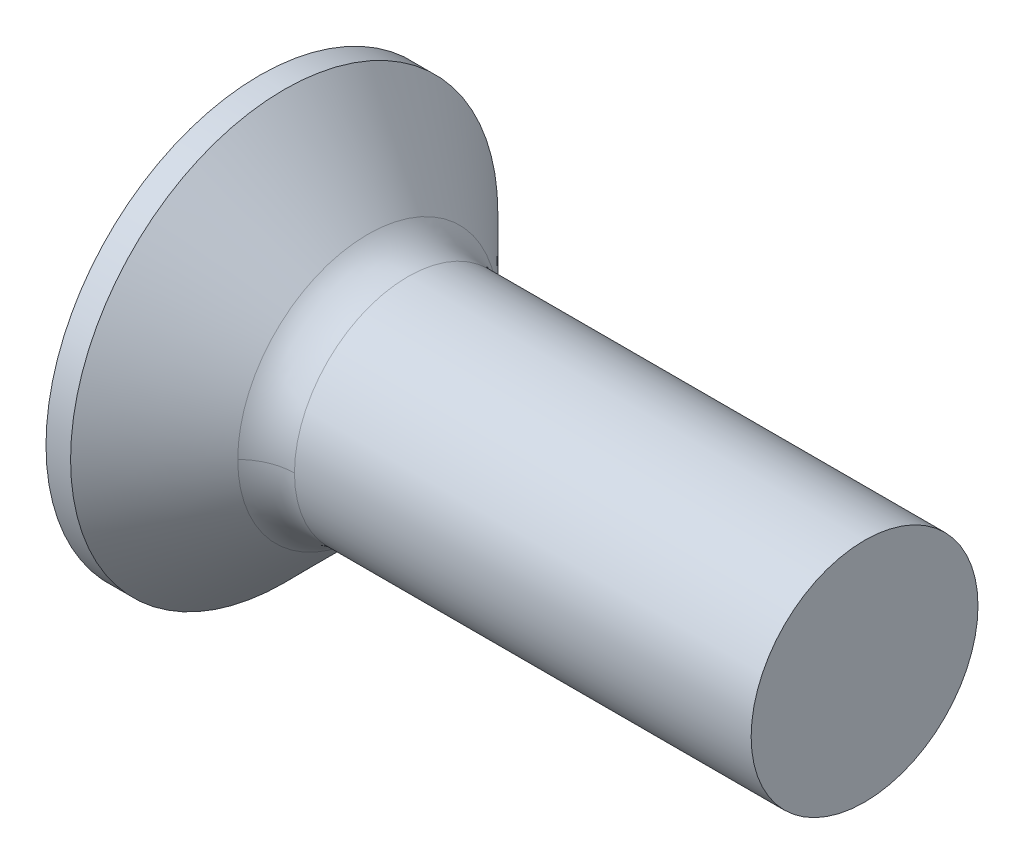
ISO-10303-21;
HEADER;
FILE_DESCRIPTION(('STEP AP214'),'2;1');
FILE_NAME('part.step','',(''),(''),'','','');
FILE_SCHEMA(('AUTOMOTIVE_DESIGN { 1 0 10303 214 1 1 1 1 }'));
ENDSEC;
DATA;
#1=APPLICATION_CONTEXT('core data for automotive mechanical design processes');
#2=APPLICATION_PROTOCOL_DEFINITION('international standard','automotive_design',2000,#1);
#3=PRODUCT_CONTEXT('',#1,'mechanical');
#4=PRODUCT('Part','Part','',(#3));
#5=PRODUCT_RELATED_PRODUCT_CATEGORY('part','',(#4));
#6=PRODUCT_DEFINITION_FORMATION('','',#4);
#7=PRODUCT_DEFINITION_CONTEXT('part definition',#1,'design');
#8=PRODUCT_DEFINITION('design','',#6,#7);
#9=PRODUCT_DEFINITION_SHAPE('','',#8);
#10=(LENGTH_UNIT() NAMED_UNIT(*) SI_UNIT(.MILLI.,.METRE.));
#11=(NAMED_UNIT(*) PLANE_ANGLE_UNIT() SI_UNIT($,.RADIAN.));
#12=(NAMED_UNIT(*) SI_UNIT($,.STERADIAN.) SOLID_ANGLE_UNIT());
#13=UNCERTAINTY_MEASURE_WITH_UNIT(LENGTH_MEASURE(1.E-05),#10,'distance_accuracy_value','');
#14=(GEOMETRIC_REPRESENTATION_CONTEXT(3) GLOBAL_UNCERTAINTY_ASSIGNED_CONTEXT((#13)) GLOBAL_UNIT_ASSIGNED_CONTEXT((#10,
#11,#12)) REPRESENTATION_CONTEXT('',''));
#15=CARTESIAN_POINT('',(0.,0.,0.));
#16=DIRECTION('',(0.,0.,1.));
#17=DIRECTION('',(1.,0.,0.));
#18=AXIS2_PLACEMENT_3D('',#15,#16,#17);
#19=CARTESIAN_POINT('',(16.,-3.036,3.036));
#20=DIRECTION('',(1.,0.,0.));
#21=DIRECTION('',(0.,0.,-1.));
#22=AXIS2_PLACEMENT_3D('',#19,#20,#21);
#23=PLANE('',#22);
#24=CARTESIAN_POINT('',(16.,0.,0.));
#25=DIRECTION('',(-1.,0.,0.));
#26=DIRECTION('',(0.,0.,1.));
#27=AXIS2_PLACEMENT_3D('',#24,#25,#26);
#28=CIRCLE('',#27,3.);
#29=CARTESIAN_POINT('',(16.,0.,3.));
#30=VERTEX_POINT('',#29);
#31=EDGE_CURVE('E20',#30,#30,#28,.F.);
#32=ORIENTED_EDGE('',*,*,#31,.T.);
#33=EDGE_LOOP('',(#32));
#34=FACE_BOUND('',#33,.T.);
#35=ADVANCED_FACE('F16',(#34),#23,.T.);
#36=CARTESIAN_POINT('',(16.,0.,0.));
#37=DIRECTION('',(-1.,0.,0.));
#38=DIRECTION('',(0.,0.,1.));
#39=AXIS2_PLACEMENT_3D('',#36,#37,#38);
#40=CYLINDRICAL_SURFACE('',#39,3.);
#41=ORIENTED_EDGE('',*,*,#31,.F.);
#42=EDGE_LOOP('',(#41));
#43=FACE_BOUND('',#42,.T.);
#44=CARTESIAN_POINT('',(3.92132034347785,0.,0.));
#45=DIRECTION('',(1.,0.,0.));
#46=DIRECTION('',(0.,0.,-1.));
#47=AXIS2_PLACEMENT_3D('',#44,#45,#46);
#48=CIRCLE('',#47,2.99999999996667);
#49=CARTESIAN_POINT('',(3.92132034360542,-3.07655142772997E-10,-2.999999999975));
#50=VERTEX_POINT('',#49);
#51=CARTESIAN_POINT('',(3.9213203434734,-1.346904426431E-10,2.999999999975));
#52=VERTEX_POINT('',#51);
#53=EDGE_CURVE('E242',#50,#52,#48,.T.);
#54=ORIENTED_EDGE('',*,*,#53,.T.);
#55=CARTESIAN_POINT('',(3.92132034347785,0.,0.));
#56=DIRECTION('',(1.,0.,0.));
#57=DIRECTION('',(0.,0.,-1.));
#58=AXIS2_PLACEMENT_3D('',#55,#56,#57);
#59=CIRCLE('',#58,2.99999999996667);
#60=EDGE_CURVE('E233',#52,#50,#59,.T.);
#61=ORIENTED_EDGE('',*,*,#60,.T.);
#62=EDGE_LOOP('',(#54,#61));
#63=FACE_BOUND('',#62,.T.);
#64=ADVANCED_FACE('F501',(#43,#63),#40,.T.);
#65=CARTESIAN_POINT('',(4.071070469,0.,3.007493752));
#66=CARTESIAN_POINT('',(4.071070469,6.014987504,3.007493752));
#67=CARTESIAN_POINT('',(4.071070469,6.014987504,-3.007493752));
#68=CARTESIAN_POINT('',(4.071070469,0.,-3.007493752));
#69=CARTESIAN_POINT('',(3.559894839,0.,2.956205113));
#70=CARTESIAN_POINT('',(3.559894839,5.912410226,2.956205113));
#71=CARTESIAN_POINT('',(3.559894839,5.912410226,-2.956205113));
#72=CARTESIAN_POINT('',(3.559894839,0.,-2.956205113));
#73=CARTESIAN_POINT('',(3.085258935,0.,3.152805742));
#74=CARTESIAN_POINT('',(3.085258935,6.305611483,3.152805742));
#75=CARTESIAN_POINT('',(3.085258935,6.305611483,-3.152805742));
#76=CARTESIAN_POINT('',(3.085258935,0.,-3.152805742));
#77=CARTESIAN_POINT('',(2.760069726,0.,3.55052804));
#78=CARTESIAN_POINT('',(2.760069726,7.10105608,3.55052804));
#79=CARTESIAN_POINT('',(2.760069726,7.10105608,-3.55052804));
#80=CARTESIAN_POINT('',(2.760069726,0.,-3.55052804));
#81=(BOUNDED_SURFACE() B_SPLINE_SURFACE(3,3,((#65,#66,#67,#68),(#69,#70,#71,#72),(#73,#74,#75,
#76),(#77,#78,#79,#80)),.UNSPECIFIED.,.F.,.F.,.F.) B_SPLINE_SURFACE_WITH_KNOTS((4,4),(4,4),(0.,
1.),(0.,1.),.UNSPECIFIED.) GEOMETRIC_REPRESENTATION_ITEM() RATIONAL_B_SPLINE_SURFACE(((1.,
0.333333333333333,0.333333333333333,1.),(0.920706259011135,0.306902086337045,0.306902086337045,
0.920706259011135),(0.920706259011135,0.306902086337045,0.306902086337045,0.920706259011135),
(1.,0.333333333333333,0.333333333333333,1.))) REPRESENTATION_ITEM('') SURFACE());
#82=CARTESIAN_POINT('',(2.86066017200004,0.,0.));
#83=DIRECTION('',(-1.,0.,0.));
#84=DIRECTION('',(0.,0.,1.));
#85=AXIS2_PLACEMENT_3D('',#82,#83,#84);
#86=CIRCLE('',#85,3.439339828);
#87=CARTESIAN_POINT('',(2.86066017203004,-1.05813058582819E-09,-3.43933982801549));
#88=VERTEX_POINT('',#87);
#89=CARTESIAN_POINT('',(2.86066017202489,-3.08830802555573E-10,3.43933982802064));
#90=VERTEX_POINT('',#89);
#91=EDGE_CURVE('E223',#88,#90,#86,.F.);
#92=CARTESIAN_POINT('',(4.071070469,0.,3.007493752));
#93=CARTESIAN_POINT('',(3.559894839,0.,2.956205113));
#94=CARTESIAN_POINT('',(3.085258935,0.,3.152805742));
#95=CARTESIAN_POINT('',(2.760069726,0.,3.55052804));
#96=(BOUNDED_CURVE() B_SPLINE_CURVE(3,(#92,#93,#94,#95),.UNSPECIFIED.,.F.,
.F.) B_SPLINE_CURVE_WITH_KNOTS((4,4),(0.,1.),
.UNSPECIFIED.) CURVE() GEOMETRIC_REPRESENTATION_ITEM() RATIONAL_B_SPLINE_CURVE((1.,
0.920706259011135,0.920706259011135,1.)) REPRESENTATION_ITEM(''));
#97=EDGE_CURVE('E234',#90,#52,#96,.F.);
#98=CARTESIAN_POINT('',(4.071070469,0.,-3.007493752));
#99=CARTESIAN_POINT('',(3.559894839,0.,-2.956205113));
#100=CARTESIAN_POINT('',(3.085258935,0.,-3.152805742));
#101=CARTESIAN_POINT('',(2.760069726,0.,-3.55052804));
#102=(BOUNDED_CURVE() B_SPLINE_CURVE(3,(#98,#99,#100,#101),.UNSPECIFIED.,.F.,
.F.) B_SPLINE_CURVE_WITH_KNOTS((4,4),(0.,1.),
.UNSPECIFIED.) CURVE() GEOMETRIC_REPRESENTATION_ITEM() RATIONAL_B_SPLINE_CURVE((1.,
0.920706259011135,0.920706259011135,1.)) REPRESENTATION_ITEM(''));
#103=EDGE_CURVE('E226',#50,#88,#102,.T.);
#104=ORIENTED_EDGE('',*,*,#91,.T.);
#105=ORIENTED_EDGE('',*,*,#97,.T.);
#106=ORIENTED_EDGE('',*,*,#53,.F.);
#107=ORIENTED_EDGE('',*,*,#103,.T.);
#108=EDGE_LOOP('',(#104,#105,#106,#107));
#109=FACE_BOUND('',#108,.T.);
#110=ADVANCED_FACE('F485',(#109),#81,.F.);
#111=CARTESIAN_POINT('',(4.071070469,0.,-3.007493752));
#112=CARTESIAN_POINT('',(4.071070469,-6.014987504,-3.007493752));
#113=CARTESIAN_POINT('',(4.071070469,-6.014987504,3.007493752));
#114=CARTESIAN_POINT('',(4.071070469,0.,3.007493752));
#115=CARTESIAN_POINT('',(3.559894839,0.,-2.956205113));
#116=CARTESIAN_POINT('',(3.559894839,-5.912410226,-2.956205113));
#117=CARTESIAN_POINT('',(3.559894839,-5.912410226,2.956205113));
#118=CARTESIAN_POINT('',(3.559894839,0.,2.956205113));
#119=CARTESIAN_POINT('',(3.085258935,0.,-3.152805742));
#120=CARTESIAN_POINT('',(3.085258935,-6.305611483,-3.152805742));
#121=CARTESIAN_POINT('',(3.085258935,-6.305611483,3.152805742));
#122=CARTESIAN_POINT('',(3.085258935,0.,3.152805742));
#123=CARTESIAN_POINT('',(2.760069726,0.,-3.55052804));
#124=CARTESIAN_POINT('',(2.760069726,-7.10105608,-3.55052804));
#125=CARTESIAN_POINT('',(2.760069726,-7.10105608,3.55052804));
#126=CARTESIAN_POINT('',(2.760069726,0.,3.55052804));
#127=(BOUNDED_SURFACE() B_SPLINE_SURFACE(3,3,((#111,#112,#113,#114),(#115,#116,#117,#118),(#119,
#120,#121,#122),(#123,#124,#125,#126)),.UNSPECIFIED.,.F.,.F.,
.F.) B_SPLINE_SURFACE_WITH_KNOTS((4,4),(4,4),(0.,1.),(0.,1.),
.UNSPECIFIED.) GEOMETRIC_REPRESENTATION_ITEM() RATIONAL_B_SPLINE_SURFACE(((1.,0.333333333333333,
0.333333333333333,1.),(0.920706259011135,0.306902086337045,0.306902086337045,0.920706259011135),
(0.920706259011135,0.306902086337045,0.306902086337045,0.920706259011135),(1.,0.333333333333333,
0.333333333333333,1.))) REPRESENTATION_ITEM('') SURFACE());
#128=CARTESIAN_POINT('',(2.86066017200004,0.,0.));
#129=DIRECTION('',(-1.,0.,0.));
#130=DIRECTION('',(0.,0.,1.));
#131=AXIS2_PLACEMENT_3D('',#128,#129,#130);
#132=CIRCLE('',#131,3.439339828);
#133=EDGE_CURVE('E219',#90,#88,#132,.F.);
#134=ORIENTED_EDGE('',*,*,#103,.F.);
#135=ORIENTED_EDGE('',*,*,#60,.F.);
#136=ORIENTED_EDGE('',*,*,#97,.F.);
#137=ORIENTED_EDGE('',*,*,#133,.T.);
#138=EDGE_LOOP('',(#134,#135,#136,#137));
#139=FACE_BOUND('',#138,.T.);
#140=ADVANCED_FACE('F477',(#139),#127,.F.);
#141=CARTESIAN_POINT('',(2.860660172,0.,0.));
#142=DIRECTION('',(-1.,0.,0.));
#143=DIRECTION('',(0.,-1.,0.));
#144=AXIS2_PLACEMENT_3D('',#141,#142,#143);
#145=CONICAL_SURFACE('',#144,3.439339828,0.785398163397448);
#146=ORIENTED_EDGE('',*,*,#133,.F.);
#147=ORIENTED_EDGE('',*,*,#91,.F.);
#148=EDGE_LOOP('',(#146,#147));
#149=FACE_BOUND('',#148,.T.);
#150=CARTESIAN_POINT('',(0.65,0.,0.));
#151=DIRECTION('',(-1.,0.,0.));
#152=DIRECTION('',(0.,0.,1.));
#153=AXIS2_PLACEMENT_3D('',#150,#151,#152);
#154=CIRCLE('',#153,5.65);
#155=CARTESIAN_POINT('',(0.65,0.,5.65));
#156=VERTEX_POINT('',#155);
#157=EDGE_CURVE('E205',#156,#156,#154,.F.);
#158=ORIENTED_EDGE('',*,*,#157,.T.);
#159=EDGE_LOOP('',(#158));
#160=FACE_BOUND('',#159,.T.);
#161=ADVANCED_FACE('F475',(#149,#160),#145,.T.);
#162=CARTESIAN_POINT('',(3.45,-1.579893512,-0.71));
#163=DIRECTION('',(-0.446197800689229,0.894934367794698,0.));
#164=DIRECTION('',(-0.894934367794698,-0.446197800689229,0.));
#165=AXIS2_PLACEMENT_3D('',#162,#163,#164);
#166=PLANE('',#165);
#167=DIRECTION('',(-0.894934367740282,-0.44619780079837,0.));
#168=VECTOR('',#167,1.);
#169=CARTESIAN_POINT('',(3.45,-1.57989351138299,0.71));
#170=LINE('',#169,#168);
#171=CARTESIAN_POINT('',(3.45,-1.5798935116915,0.71));
#172=VERTEX_POINT('',#171);
#173=CARTESIAN_POINT('',(-9.15153369751565E-12,-3.29999999998164,0.710000002242601));
#174=VERTEX_POINT('',#173);
#175=EDGE_CURVE('E202',#172,#174,#170,.T.);
#176=ORIENTED_EDGE('',*,*,#175,.F.);
#177=DIRECTION('',(0.,0.,-1.));
#178=VECTOR('',#177,1.);
#179=CARTESIAN_POINT('',(3.45,-1.579893512,0.));
#180=LINE('',#179,#178);
#181=CARTESIAN_POINT('',(3.45,-1.5798935116915,-0.71));
#182=VERTEX_POINT('',#181);
#183=EDGE_CURVE('E217',#172,#182,#180,.T.);
#184=ORIENTED_EDGE('',*,*,#183,.T.);
#185=DIRECTION('',(0.894934367740282,0.44619780079837,0.));
#186=VECTOR('',#185,1.);
#187=CARTESIAN_POINT('',(0.,-3.29999999990833,-0.71));
#188=LINE('',#187,#186);
#189=CARTESIAN_POINT('',(-9.15155371455694E-12,-3.29999999998164,-0.7100000022426));
#190=VERTEX_POINT('',#189);
#191=EDGE_CURVE('E158',#190,#182,#188,.T.);
#192=ORIENTED_EDGE('',*,*,#191,.F.);
#193=DIRECTION('',(0.,0.,1.));
#194=VECTOR('',#193,1.);
#195=CARTESIAN_POINT('',(0.,-3.3,0.));
#196=LINE('',#195,#194);
#197=EDGE_CURVE('E164',#190,#174,#196,.T.);
#198=ORIENTED_EDGE('',*,*,#197,.T.);
#199=EDGE_LOOP('',(#176,#184,#192,#198));
#200=FACE_BOUND('',#199,.T.);
#201=ADVANCED_FACE('F462',(#200),#166,.T.);
#202=CARTESIAN_POINT('',(3.45,0.,0.));
#203=DIRECTION('',(-1.,0.,0.));
#204=DIRECTION('',(0.,0.,1.));
#205=AXIS2_PLACEMENT_3D('',#202,#203,#204);
#206=CONICAL_SURFACE('',#205,1.2805,0.0698131700206101);
#207=CARTESIAN_POINT('',(0.,0.,0.));
#208=DIRECTION('',(-1.,0.,0.));
#209=DIRECTION('',(0.,0.,1.));
#210=AXIS2_PLACEMENT_3D('',#207,#208,#209);
#211=CIRCLE('',#210,1.521747501);
#212=CARTESIAN_POINT('',(-1.98757490879553E-11,-0.7100000022426,-1.34596264941472));
#213=VERTEX_POINT('',#212);
#214=CARTESIAN_POINT('',(-2.0018081073557E-11,-1.34596264941473,-0.7100000022426));
#215=VERTEX_POINT('',#214);
#216=EDGE_CURVE('E138',#213,#215,#211,.T.);
#217=ORIENTED_EDGE('',*,*,#216,.T.);
#218=CARTESIAN_POINT('',(3.44999999996933,-1.06563607763892,-0.709999999965281));
#219=CARTESIAN_POINT('',(3.05239804319664,-1.09903290978623,-0.709999999987832));
#220=CARTESIAN_POINT('',(2.65475821752246,-1.13197492179622,-0.709999999996809));
#221=CARTESIAN_POINT('',(1.859418568149,-1.19711780637158,-0.710000000003191));
#222=CARTESIAN_POINT('',(1.46171874456479,-1.22931868034064,-0.710000000000595));
#223=CARTESIAN_POINT('',(0.886672014067367,-1.2754623780766,-0.709999999999735));
#224=CARTESIAN_POINT('',(0.70934344088065,-1.2896345562043,-0.709999999999868));
#225=CARTESIAN_POINT('',(0.354677833209052,-1.31787453536712,-0.710000000000133));
#226=CARTESIAN_POINT('',(0.177340798717209,-1.33194233631483,-0.710000000000265));
#227=CARTESIAN_POINT('',(-4.00360912278943E-11,-1.34596265059929,-0.71));
#228=B_SPLINE_CURVE_WITH_KNOTS('',3,(#218,#219,#220,#221,#222,#223,#224,#225,#226,#227),
.UNSPECIFIED.,.F.,.F.,(4,2,2,2,4),(0.,1.19700553542681,2.39400880358524,2.92769077313542,
3.46137318953635),.UNSPECIFIED.);
#229=CARTESIAN_POINT('',(3.44999999999998,-1.06563607782568,-0.709999999743873));
#230=VERTEX_POINT('',#229);
#231=EDGE_CURVE('E144',#230,#215,#228,.T.);
#232=ORIENTED_EDGE('',*,*,#231,.F.);
#233=CARTESIAN_POINT('',(3.44999999999995,0.,0.));
#234=DIRECTION('',(-1.,0.,0.));
#235=DIRECTION('',(0.,0.,1.));
#236=AXIS2_PLACEMENT_3D('',#233,#234,#235);
#237=CIRCLE('',#236,1.2805);
#238=CARTESIAN_POINT('',(3.44999999999995,-0.709999999757469,-1.06563607781662));
#239=VERTEX_POINT('',#238);
#240=EDGE_CURVE('E149',#230,#239,#237,.F.);
#241=ORIENTED_EDGE('',*,*,#240,.T.);
#242=CARTESIAN_POINT('',(-3.97514937370692E-11,-0.71,-1.34596265059927));
#243=CARTESIAN_POINT('',(0.472697147041394,-0.71,-1.30857045299318));
#244=CARTESIAN_POINT('',(0.945371396486863,-0.71,-1.2708795223401));
#245=CARTESIAN_POINT('',(1.89064711681851,-0.71,-1.19461362364889));
#246=CARTESIAN_POINT('',(2.36324858790939,-0.71,-1.15603865814475));
#247=CARTESIAN_POINT('',(3.04054381210254,-0.71,-1.09991132788619));
#248=CARTESIAN_POINT('',(3.24527698184166,-0.71,-1.08283447895016));
#249=CARTESIAN_POINT('',(3.44999999997136,-0.71,-1.06563607765744));
#250=B_SPLINE_CURVE_WITH_KNOTS('',3,(#242,#243,#244,#245,#246,#247,#248,#249),.UNSPECIFIED.,.F.,
.F.,(4,2,2,4),(0.,1.42252243057653,2.84504078416987,3.4613730974833),.UNSPECIFIED.);
#251=EDGE_CURVE('E146',#213,#239,#250,.T.);
#252=ORIENTED_EDGE('',*,*,#251,.F.);
#253=EDGE_LOOP('',(#217,#232,#241,#252));
#254=FACE_BOUND('',#253,.T.);
#255=ADVANCED_FACE('F143',(#254),#206,.F.);
#256=CARTESIAN_POINT('',(3.45,0.71,-1.579893512));
#257=DIRECTION('',(-0.446197800689229,0.,0.894934367794698));
#258=DIRECTION('',(-0.894934367794698,0.,-0.446197800689229));
#259=AXIS2_PLACEMENT_3D('',#256,#257,#258);
#260=PLANE('',#259);
#261=DIRECTION('',(-0.894934367740282,0.,-0.44619780079837));
#262=VECTOR('',#261,1.);
#263=CARTESIAN_POINT('',(3.45,-0.71,-1.57989351138299));
#264=LINE('',#263,#262);
#265=CARTESIAN_POINT('',(3.45,-0.71,-1.5798935116915));
#266=VERTEX_POINT('',#265);
#267=CARTESIAN_POINT('',(-9.15153369751565E-12,-0.7100000022426,-3.29999999998164));
#268=VERTEX_POINT('',#267);
#269=EDGE_CURVE('E198',#266,#268,#264,.T.);
#270=ORIENTED_EDGE('',*,*,#269,.F.);
#271=DIRECTION('',(0.,1.,0.));
#272=VECTOR('',#271,1.);
#273=CARTESIAN_POINT('',(3.45,0.,-1.579893512));
#274=LINE('',#273,#272);
#275=CARTESIAN_POINT('',(3.45,0.71,-1.5798935116915));
#276=VERTEX_POINT('',#275);
#277=EDGE_CURVE('E214',#266,#276,#274,.T.);
#278=ORIENTED_EDGE('',*,*,#277,.T.);
#279=DIRECTION('',(0.894934367740282,0.,0.44619780079837));
#280=VECTOR('',#279,1.);
#281=CARTESIAN_POINT('',(0.,0.71,-3.29999999990833));
#282=LINE('',#281,#280);
#283=CARTESIAN_POINT('',(-9.15155371455694E-12,0.710000002242601,-3.29999999998164));
#284=VERTEX_POINT('',#283);
#285=EDGE_CURVE('E360',#284,#276,#282,.T.);
#286=ORIENTED_EDGE('',*,*,#285,.F.);
#287=DIRECTION('',(0.,-1.,0.));
#288=VECTOR('',#287,1.);
#289=CARTESIAN_POINT('',(0.,0.,-3.3));
#290=LINE('',#289,#288);
#291=EDGE_CURVE('E148',#284,#268,#290,.T.);
#292=ORIENTED_EDGE('',*,*,#291,.T.);
#293=EDGE_LOOP('',(#270,#278,#286,#292));
#294=FACE_BOUND('',#293,.T.);
#295=ADVANCED_FACE('F381',(#294),#260,.T.);
#296=CARTESIAN_POINT('',(3.45,0.,0.));
#297=DIRECTION('',(-1.,0.,0.));
#298=DIRECTION('',(0.,0.,1.));
#299=AXIS2_PLACEMENT_3D('',#296,#297,#298);
#300=CONICAL_SURFACE('',#299,1.2805,0.0698131700206101);
#301=CARTESIAN_POINT('',(3.44999999999995,0.,0.));
#302=DIRECTION('',(-1.,0.,0.));
#303=DIRECTION('',(0.,0.,1.));
#304=AXIS2_PLACEMENT_3D('',#301,#302,#303);
#305=CIRCLE('',#304,1.2805);
#306=CARTESIAN_POINT('',(3.44999999999998,0.709999999853156,-1.06563607775287));
#307=VERTEX_POINT('',#306);
#308=CARTESIAN_POINT('',(3.44999999999352,1.06563607753498,-0.710000000181004));
#309=VERTEX_POINT('',#308);
#310=EDGE_CURVE('E209',#307,#309,#305,.F.);
#311=ORIENTED_EDGE('',*,*,#310,.T.);
#312=CARTESIAN_POINT('',(-4.20398786480878E-11,1.34596265059945,-0.71));
#313=CARTESIAN_POINT('',(0.472697147039157,1.30857045299336,-0.71));
#314=CARTESIAN_POINT('',(0.945371396484674,1.27087952234027,-0.71));
#315=CARTESIAN_POINT('',(1.89064711681642,1.19461362364906,-0.71));
#316=CARTESIAN_POINT('',(2.36324858790735,1.15603865814491,-0.71));
#317=CARTESIAN_POINT('',(3.04054381210645,1.09991132788587,-0.71));
#318=CARTESIAN_POINT('',(3.24527698185149,1.08283447894934,-0.71));
#319=CARTESIAN_POINT('',(3.44999999998709,1.06563607765612,-0.71));
#320=B_SPLINE_CURVE_WITH_KNOTS('',3,(#312,#313,#314,#315,#316,#317,#318,#319),.UNSPECIFIED.,.F.,
.F.,(4,2,2,4),(0.,1.42252243057668,2.84504078417017,3.46137309750138),.UNSPECIFIED.);
#321=CARTESIAN_POINT('',(-2.10199421441777E-11,1.34596264941481,-0.7100000022426));
#322=VERTEX_POINT('',#321);
#323=EDGE_CURVE('E193',#322,#309,#320,.T.);
#324=ORIENTED_EDGE('',*,*,#323,.F.);
#325=CARTESIAN_POINT('',(0.,0.,0.));
#326=DIRECTION('',(-1.,0.,0.));
#327=DIRECTION('',(0.,0.,1.));
#328=AXIS2_PLACEMENT_3D('',#325,#326,#327);
#329=CIRCLE('',#328,1.521747501);
#330=CARTESIAN_POINT('',(-2.44523019773076E-11,0.710000002242601,-1.34596264941508));
#331=VERTEX_POINT('',#330);
#332=EDGE_CURVE('E212',#322,#331,#329,.T.);
#333=ORIENTED_EDGE('',*,*,#332,.T.);
#334=CARTESIAN_POINT('',(3.44999999997501,0.710000000001709,-1.06563607765805));
#335=CARTESIAN_POINT('',(3.0523980432014,0.710000000000599,-1.09903290979271));
#336=CARTESIAN_POINT('',(2.65475821752692,0.710000000000157,-1.13197492179766));
#337=CARTESIAN_POINT('',(1.8594185681534,0.709999999999843,-1.19711780636942));
#338=CARTESIAN_POINT('',(1.46171874456944,0.709999999999971,-1.22931868033993));
#339=CARTESIAN_POINT('',(0.88667201406989,0.710000000000013,-1.27546237807654));
#340=CARTESIAN_POINT('',(0.709343440880891,0.710000000000007,-1.28963455620435));
#341=CARTESIAN_POINT('',(0.354677833204729,0.709999999999994,-1.31787453536739));
#342=CARTESIAN_POINT('',(0.177340798710604,0.709999999999987,-1.3319423363152));
#343=CARTESIAN_POINT('',(-4.89046651199288E-11,0.71,-1.34596265059999));
#344=B_SPLINE_CURVE_WITH_KNOTS('',3,(#334,#335,#336,#337,#338,#339,#340,#341,#342,#343),
.UNSPECIFIED.,.F.,.F.,(4,2,2,2,4),(0.,1.19700553542644,2.39400880358452,2.92769077314155,
3.46137318954933),.UNSPECIFIED.);
#345=EDGE_CURVE('E197',#307,#331,#344,.T.);
#346=ORIENTED_EDGE('',*,*,#345,.F.);
#347=EDGE_LOOP('',(#311,#324,#333,#346));
#348=FACE_BOUND('',#347,.T.);
#349=ADVANCED_FACE('F376',(#348),#300,.F.);
#350=CARTESIAN_POINT('',(0.,3.3,-0.71));
#351=DIRECTION('',(-0.446197800689229,-0.894934367794698,0.));
#352=DIRECTION('',(0.894934367794698,-0.446197800689229,0.));
#353=AXIS2_PLACEMENT_3D('',#350,#351,#352);
#354=PLANE('',#353);
#355=DIRECTION('',(-0.894934367740282,0.44619780079837,0.));
#356=VECTOR('',#355,1.);
#357=CARTESIAN_POINT('',(3.45,1.57989351138299,-0.71));
#358=LINE('',#357,#356);
#359=CARTESIAN_POINT('',(3.45,1.5798935116915,-0.71));
#360=VERTEX_POINT('',#359);
#361=CARTESIAN_POINT('',(-9.15153369751565E-12,3.29999999998164,-0.7100000022426));
#362=VERTEX_POINT('',#361);
#363=EDGE_CURVE('E190',#360,#362,#358,.T.);
#364=ORIENTED_EDGE('',*,*,#363,.F.);
#365=DIRECTION('',(0.,0.,1.));
#366=VECTOR('',#365,1.);
#367=CARTESIAN_POINT('',(3.45,1.579893512,0.));
#368=LINE('',#367,#366);
#369=CARTESIAN_POINT('',(3.45,1.5798935116915,0.71));
#370=VERTEX_POINT('',#369);
#371=EDGE_CURVE('E208',#360,#370,#368,.T.);
#372=ORIENTED_EDGE('',*,*,#371,.T.);
#373=DIRECTION('',(0.894934367740282,-0.44619780079837,0.));
#374=VECTOR('',#373,1.);
#375=CARTESIAN_POINT('',(0.,3.29999999990833,0.71));
#376=LINE('',#375,#374);
#377=CARTESIAN_POINT('',(-9.15155371455694E-12,3.29999999998164,0.710000002242601));
#378=VERTEX_POINT('',#377);
#379=EDGE_CURVE('E187',#378,#370,#376,.T.);
#380=ORIENTED_EDGE('',*,*,#379,.F.);
#381=DIRECTION('',(0.,0.,-1.));
#382=VECTOR('',#381,1.);
#383=CARTESIAN_POINT('',(0.,3.3,0.));
#384=LINE('',#383,#382);
#385=EDGE_CURVE('E206',#378,#362,#384,.T.);
#386=ORIENTED_EDGE('',*,*,#385,.T.);
#387=EDGE_LOOP('',(#364,#372,#380,#386));
#388=FACE_BOUND('',#387,.T.);
#389=ADVANCED_FACE('F380',(#388),#354,.T.);
#390=CARTESIAN_POINT('',(0.65,0.,0.));
#391=DIRECTION('',(-1.,0.,0.));
#392=DIRECTION('',(0.,0.,1.));
#393=AXIS2_PLACEMENT_3D('',#390,#391,#392);
#394=CYLINDRICAL_SURFACE('',#393,5.65);
#395=ORIENTED_EDGE('',*,*,#157,.F.);
#396=EDGE_LOOP('',(#395));
#397=FACE_BOUND('',#396,.T.);
#398=CARTESIAN_POINT('',(0.,0.,0.));
#399=DIRECTION('',(-1.,0.,0.));
#400=DIRECTION('',(0.,0.,1.));
#401=AXIS2_PLACEMENT_3D('',#398,#399,#400);
#402=CIRCLE('',#401,5.65);
#403=CARTESIAN_POINT('',(0.,0.,5.65));
#404=VERTEX_POINT('',#403);
#405=EDGE_CURVE('E400',#404,#404,#402,.T.);
#406=ORIENTED_EDGE('',*,*,#405,.F.);
#407=EDGE_LOOP('',(#406));
#408=FACE_BOUND('',#407,.T.);
#409=ADVANCED_FACE('F382',(#397,#408),#394,.T.);
#410=CARTESIAN_POINT('',(0.,-3.313406184,0.71));
#411=DIRECTION('',(0.,0.,-1.));
#412=DIRECTION('',(0.,1.,0.));
#413=AXIS2_PLACEMENT_3D('',#410,#411,#412);
#414=PLANE('',#413);
#415=DIRECTION('',(0.,-1.,0.));
#416=VECTOR('',#415,1.);
#417=CARTESIAN_POINT('',(3.45,-2.182818039,0.71));
#418=LINE('',#417,#416);
#419=CARTESIAN_POINT('',(3.44999999999998,-1.06563607774381,0.709999999866751));
#420=VERTEX_POINT('',#419);
#421=EDGE_CURVE('E203',#420,#172,#418,.T.);
#422=ORIENTED_EDGE('',*,*,#421,.T.);
#423=ORIENTED_EDGE('',*,*,#175,.T.);
#424=DIRECTION('',(0.,-1.,0.));
#425=VECTOR('',#424,1.);
#426=CARTESIAN_POINT('',(0.,0.,0.710000004485201));
#427=LINE('',#426,#425);
#428=CARTESIAN_POINT('',(-3.16977542704161E-11,-1.34596264941565,0.710000002242601));
#429=VERTEX_POINT('',#428);
#430=EDGE_CURVE('E167',#429,#174,#427,.T.);
#431=ORIENTED_EDGE('',*,*,#430,.F.);
#432=CARTESIAN_POINT('',(3.44999999997908,-1.06563607765719,0.71000000000074));
#433=CARTESIAN_POINT('',(3.05239804320558,-1.09903290979218,0.71000000000026));
#434=CARTESIAN_POINT('',(2.6547582175312,-1.13197492179726,0.710000000000068));
#435=CARTESIAN_POINT('',(1.85941856815787,-1.19711780636911,0.709999999999932));
#436=CARTESIAN_POINT('',(1.46171874457399,-1.22931868033957,0.709999999999987));
#437=CARTESIAN_POINT('',(0.88667201407134,-1.27546237807643,0.710000000000006));
#438=CARTESIAN_POINT('',(0.709343440879154,-1.28963455620449,0.710000000000003));
#439=CARTESIAN_POINT('',(0.354677833196615,-1.31787453536803,0.709999999999997));
#440=CARTESIAN_POINT('',(0.177340798699302,-1.3319423363161,0.709999999999995));
#441=CARTESIAN_POINT('',(-6.33953695709904E-11,-1.34596265060114,0.71));
#442=B_SPLINE_CURVE_WITH_KNOTS('',3,(#432,#433,#434,#435,#436,#437,#438,#439,#440,#441),
.UNSPECIFIED.,.F.,.F.,(4,2,2,2,4),(0.,1.19700553542617,2.39400880358399,2.92769077315061,
3.46137318956799),.UNSPECIFIED.);
#443=EDGE_CURVE('E186',#420,#429,#442,.T.);
#444=ORIENTED_EDGE('',*,*,#443,.F.);
#445=EDGE_LOOP('',(#422,#423,#431,#444));
#446=FACE_BOUND('',#445,.T.);
#447=ADVANCED_FACE('F401',(#446),#414,.T.);
#448=CARTESIAN_POINT('',(0.,-3.313406184,-0.71));
#449=DIRECTION('',(0.,0.,1.));
#450=DIRECTION('',(1.,0.,0.));
#451=AXIS2_PLACEMENT_3D('',#448,#449,#450);
#452=PLANE('',#451);
#453=DIRECTION('',(0.,1.,0.));
#454=VECTOR('',#453,1.);
#455=CARTESIAN_POINT('',(0.,0.,-0.710000004485199));
#456=LINE('',#455,#454);
#457=EDGE_CURVE('E154',#190,#215,#456,.T.);
#458=ORIENTED_EDGE('',*,*,#457,.F.);
#459=ORIENTED_EDGE('',*,*,#191,.T.);
#460=DIRECTION('',(0.,1.,0.));
#461=VECTOR('',#460,1.);
#462=CARTESIAN_POINT('',(3.45,-2.182818039,-0.71));
#463=LINE('',#462,#461);
#464=EDGE_CURVE('E156',#182,#230,#463,.T.);
#465=ORIENTED_EDGE('',*,*,#464,.T.);
#466=ORIENTED_EDGE('',*,*,#231,.T.);
#467=EDGE_LOOP('',(#458,#459,#465,#466));
#468=FACE_BOUND('',#467,.T.);
#469=ADVANCED_FACE('F152',(#468),#452,.T.);
#470=CARTESIAN_POINT('',(0.,-0.71,-3.313406184));
#471=DIRECTION('',(0.,1.,0.));
#472=DIRECTION('',(0.,0.,1.));
#473=AXIS2_PLACEMENT_3D('',#470,#471,#472);
#474=PLANE('',#473);
#475=DIRECTION('',(0.,0.,-1.));
#476=VECTOR('',#475,1.);
#477=CARTESIAN_POINT('',(3.45,-0.71,-2.182818039));
#478=LINE('',#477,#476);
#479=EDGE_CURVE('E199',#239,#266,#478,.T.);
#480=ORIENTED_EDGE('',*,*,#479,.T.);
#481=ORIENTED_EDGE('',*,*,#269,.T.);
#482=DIRECTION('',(0.,0.,-1.));
#483=VECTOR('',#482,1.);
#484=CARTESIAN_POINT('',(0.,-0.710000004485199,0.));
#485=LINE('',#484,#483);
#486=EDGE_CURVE('E166',#213,#268,#485,.T.);
#487=ORIENTED_EDGE('',*,*,#486,.F.);
#488=ORIENTED_EDGE('',*,*,#251,.T.);
#489=EDGE_LOOP('',(#480,#481,#487,#488));
#490=FACE_BOUND('',#489,.T.);
#491=ADVANCED_FACE('F410',(#490),#474,.T.);
#492=CARTESIAN_POINT('',(0.,0.71,-3.313406184));
#493=DIRECTION('',(0.,-1.,0.));
#494=DIRECTION('',(1.,0.,0.));
#495=AXIS2_PLACEMENT_3D('',#492,#493,#494);
#496=PLANE('',#495);
#497=DIRECTION('',(0.,0.,1.));
#498=VECTOR('',#497,1.);
#499=CARTESIAN_POINT('',(0.,0.710000004485201,0.));
#500=LINE('',#499,#498);
#501=EDGE_CURVE('E169',#284,#331,#500,.T.);
#502=ORIENTED_EDGE('',*,*,#501,.F.);
#503=ORIENTED_EDGE('',*,*,#285,.T.);
#504=DIRECTION('',(0.,0.,1.));
#505=VECTOR('',#504,1.);
#506=CARTESIAN_POINT('',(3.45,0.71,-2.182818039));
#507=LINE('',#506,#505);
#508=EDGE_CURVE('E194',#276,#307,#507,.T.);
#509=ORIENTED_EDGE('',*,*,#508,.T.);
#510=ORIENTED_EDGE('',*,*,#345,.T.);
#511=EDGE_LOOP('',(#502,#503,#509,#510));
#512=FACE_BOUND('',#511,.T.);
#513=ADVANCED_FACE('F359',(#512),#496,.T.);
#514=CARTESIAN_POINT('',(0.,1.052229894,-0.71));
#515=DIRECTION('',(0.,0.,1.));
#516=DIRECTION('',(1.,0.,0.));
#517=AXIS2_PLACEMENT_3D('',#514,#515,#516);
#518=PLANE('',#517);
#519=DIRECTION('',(0.,1.,0.));
#520=VECTOR('',#519,1.);
#521=CARTESIAN_POINT('',(3.45,2.182818039,-0.71));
#522=LINE('',#521,#520);
#523=EDGE_CURVE('E191',#309,#360,#522,.T.);
#524=ORIENTED_EDGE('',*,*,#523,.T.);
#525=ORIENTED_EDGE('',*,*,#363,.T.);
#526=DIRECTION('',(0.,1.,0.));
#527=VECTOR('',#526,1.);
#528=CARTESIAN_POINT('',(0.,0.,-0.710000004485199));
#529=LINE('',#528,#527);
#530=EDGE_CURVE('E350',#322,#362,#529,.T.);
#531=ORIENTED_EDGE('',*,*,#530,.F.);
#532=ORIENTED_EDGE('',*,*,#323,.T.);
#533=EDGE_LOOP('',(#524,#525,#531,#532));
#534=FACE_BOUND('',#533,.T.);
#535=ADVANCED_FACE('F303',(#534),#518,.T.);
#536=CARTESIAN_POINT('',(0.,1.052229894,0.71));
#537=DIRECTION('',(0.,0.,-1.));
#538=DIRECTION('',(0.,1.,0.));
#539=AXIS2_PLACEMENT_3D('',#536,#537,#538);
#540=PLANE('',#539);
#541=DIRECTION('',(0.,-1.,0.));
#542=VECTOR('',#541,1.);
#543=CARTESIAN_POINT('',(0.,0.,0.710000004485201));
#544=LINE('',#543,#542);
#545=CARTESIAN_POINT('',(0.,1.34596264941314,0.710000002242601));
#546=VERTEX_POINT('',#545);
#547=EDGE_CURVE('E178',#378,#546,#544,.T.);
#548=ORIENTED_EDGE('',*,*,#547,.F.);
#549=ORIENTED_EDGE('',*,*,#379,.T.);
#550=DIRECTION('',(0.,-1.,0.));
#551=VECTOR('',#550,1.);
#552=CARTESIAN_POINT('',(3.45,2.182818039,0.71));
#553=LINE('',#552,#551);
#554=CARTESIAN_POINT('',(3.44999999999218,1.06563607768071,0.709999999962439));
#555=VERTEX_POINT('',#554);
#556=EDGE_CURVE('E188',#370,#555,#553,.T.);
#557=ORIENTED_EDGE('',*,*,#556,.T.);
#558=CARTESIAN_POINT('',(-5.93884078238237E-11,1.34596265060082,0.71));
#559=CARTESIAN_POINT('',(0.472697147022186,1.30857045299471,0.71));
#560=CARTESIAN_POINT('',(0.94537139646808,1.2708795223416,0.71));
#561=CARTESIAN_POINT('',(1.89064711680058,1.19461362365035,0.71));
#562=CARTESIAN_POINT('',(2.36324858789189,1.15603865814618,0.71));
#563=CARTESIAN_POINT('',(3.0405438120955,1.09991132788678,0.71));
#564=CARTESIAN_POINT('',(3.24527698184466,1.08283447894991,0.71));
#565=CARTESIAN_POINT('',(3.44999999998439,1.06563607765634,0.71));
#566=B_SPLINE_CURVE_WITH_KNOTS('',3,(#558,#559,#560,#561,#562,#563,#564,#565),.UNSPECIFIED.,.F.,
.F.,(4,2,2,4),(0.,1.42252243057782,2.84504078417244,3.46137309751608),.UNSPECIFIED.);
#567=EDGE_CURVE('E288',#546,#555,#566,.T.);
#568=ORIENTED_EDGE('',*,*,#567,.F.);
#569=EDGE_LOOP('',(#548,#549,#557,#568));
#570=FACE_BOUND('',#569,.T.);
#571=ADVANCED_FACE('F298',(#570),#540,.T.);
#572=CARTESIAN_POINT('',(3.45,0.,0.));
#573=DIRECTION('',(-1.,0.,0.));
#574=DIRECTION('',(0.,0.,1.));
#575=AXIS2_PLACEMENT_3D('',#572,#573,#574);
#576=CONICAL_SURFACE('',#575,1.2805,0.0698131700206101);
#577=CARTESIAN_POINT('',(3.44999999999995,0.,0.));
#578=DIRECTION('',(-1.,0.,0.));
#579=DIRECTION('',(0.,0.,1.));
#580=AXIS2_PLACEMENT_3D('',#577,#578,#579);
#581=CIRCLE('',#580,1.2805);
#582=CARTESIAN_POINT('',(3.44999999999998,-0.710000000167409,1.06563607754349));
#583=VERTEX_POINT('',#582);
#584=EDGE_CURVE('E184',#583,#420,#581,.F.);
#585=ORIENTED_EDGE('',*,*,#584,.T.);
#586=ORIENTED_EDGE('',*,*,#443,.T.);
#587=CARTESIAN_POINT('',(0.,0.,0.));
#588=DIRECTION('',(-1.,0.,0.));
#589=DIRECTION('',(0.,0.,1.));
#590=AXIS2_PLACEMENT_3D('',#587,#588,#589);
#591=CIRCLE('',#590,1.521747501);
#592=CARTESIAN_POINT('',(-1.17565050384127E-12,-0.71,1.34596265059622));
#593=VERTEX_POINT('',#592);
#594=EDGE_CURVE('E171',#593,#429,#591,.F.);
#595=ORIENTED_EDGE('',*,*,#594,.F.);
#596=CARTESIAN_POINT('',(3.44999999998658,-0.71,1.06563607765616));
#597=CARTESIAN_POINT('',(3.05239804321327,-0.71,1.0990329097914));
#598=CARTESIAN_POINT('',(2.65475821753906,-0.71,1.13197492179657));
#599=CARTESIAN_POINT('',(1.85941856816606,-0.71,1.19711780636848));
#600=CARTESIAN_POINT('',(1.46171874458234,-0.71,1.2293186803389));
#601=CARTESIAN_POINT('',(0.886672014088613,-0.71,1.27546237807504));
#602=CARTESIAN_POINT('',(0.709343440905181,-0.71,1.28963455620241));
#603=CARTESIAN_POINT('',(0.35467783324015,-0.71,1.31787453536458));
#604=CARTESIAN_POINT('',(0.177340798751592,-0.71,1.33194233631196));
#605=CARTESIAN_POINT('',(-2.35122242110105E-12,-0.71,1.34596265059631));
#606=B_SPLINE_CURVE_WITH_KNOTS('',3,(#596,#597,#598,#599,#600,#601,#602,#603,#604,#605),
.UNSPECIFIED.,.F.,.F.,(4,2,2,2,4),(0.,1.19700553542568,2.39400880358301,2.92769077312329,
3.46137318951432),.UNSPECIFIED.);
#607=EDGE_CURVE('E267',#583,#593,#606,.T.);
#608=ORIENTED_EDGE('',*,*,#607,.F.);
#609=EDGE_LOOP('',(#585,#586,#595,#608));
#610=FACE_BOUND('',#609,.T.);
#611=ADVANCED_FACE('F284',(#610),#576,.F.);
#612=CARTESIAN_POINT('',(0.,-5.7178,-5.7178));
#613=DIRECTION('',(-1.,0.,0.));
#614=DIRECTION('',(0.,0.,1.));
#615=AXIS2_PLACEMENT_3D('',#612,#613,#614);
#616=PLANE('',#615);
#617=DIRECTION('',(0.,0.,-1.));
#618=VECTOR('',#617,1.);
#619=CARTESIAN_POINT('',(0.,0.71,2.182818039));
#620=LINE('',#619,#618);
#621=CARTESIAN_POINT('',(6.10087790472077E-12,0.71,3.30000000036533));
#622=VERTEX_POINT('',#621);
#623=CARTESIAN_POINT('',(0.,0.71,1.34596265059612));
#624=VERTEX_POINT('',#623);
#625=EDGE_CURVE('E266',#622,#624,#620,.T.);
#626=ORIENTED_EDGE('',*,*,#625,.F.);
#627=DIRECTION('',(0.,-1.,0.));
#628=VECTOR('',#627,1.);
#629=CARTESIAN_POINT('',(0.,0.,3.3000000011968));
#630=LINE('',#629,#628);
#631=CARTESIAN_POINT('',(-4.90329709705121E-11,-0.710000001495066,3.30000000039282));
#632=VERTEX_POINT('',#631);
#633=EDGE_CURVE('E175',#622,#632,#630,.T.);
#634=ORIENTED_EDGE('',*,*,#633,.T.);
#635=DIRECTION('',(0.,0.,1.));
#636=VECTOR('',#635,1.);
#637=CARTESIAN_POINT('',(0.,-0.71,2.182818039));
#638=LINE('',#637,#636);
#639=EDGE_CURVE('E338',#593,#632,#638,.T.);
#640=ORIENTED_EDGE('',*,*,#639,.F.);
#641=ORIENTED_EDGE('',*,*,#594,.T.);
#642=ORIENTED_EDGE('',*,*,#430,.T.);
#643=ORIENTED_EDGE('',*,*,#197,.F.);
#644=ORIENTED_EDGE('',*,*,#457,.T.);
#645=ORIENTED_EDGE('',*,*,#216,.F.);
#646=ORIENTED_EDGE('',*,*,#486,.T.);
#647=ORIENTED_EDGE('',*,*,#291,.F.);
#648=ORIENTED_EDGE('',*,*,#501,.T.);
#649=ORIENTED_EDGE('',*,*,#332,.F.);
#650=ORIENTED_EDGE('',*,*,#530,.T.);
#651=ORIENTED_EDGE('',*,*,#385,.F.);
#652=ORIENTED_EDGE('',*,*,#547,.T.);
#653=CARTESIAN_POINT('',(0.,0.,0.));
#654=DIRECTION('',(-1.,0.,0.));
#655=DIRECTION('',(0.,0.,1.));
#656=AXIS2_PLACEMENT_3D('',#653,#654,#655);
#657=CIRCLE('',#656,1.521747501);
#658=EDGE_CURVE('E296',#624,#546,#657,.T.);
#659=ORIENTED_EDGE('',*,*,#658,.F.);
#660=EDGE_LOOP('',(#626,#634,#640,#641,#642,#643,#644,#645,#646,#647,#648,#649,#650,#651,#652,#659));
#661=FACE_BOUND('',#660,.T.);
#662=ORIENTED_EDGE('',*,*,#405,.T.);
#663=EDGE_LOOP('',(#662));
#664=FACE_BOUND('',#663,.T.);
#665=ADVANCED_FACE('F161',(#661,#664),#616,.T.);
#666=CARTESIAN_POINT('',(3.45,0.,0.));
#667=DIRECTION('',(-1.,0.,0.));
#668=DIRECTION('',(0.,0.,1.));
#669=AXIS2_PLACEMENT_3D('',#666,#667,#668);
#670=CONICAL_SURFACE('',#669,1.2805,0.0698131700206101);
#671=ORIENTED_EDGE('',*,*,#658,.T.);
#672=ORIENTED_EDGE('',*,*,#567,.T.);
#673=CARTESIAN_POINT('',(3.44999999999995,0.,0.));
#674=DIRECTION('',(-1.,0.,0.));
#675=DIRECTION('',(0.,0.,1.));
#676=AXIS2_PLACEMENT_3D('',#673,#674,#675);
#677=CIRCLE('',#676,1.2805);
#678=CARTESIAN_POINT('',(3.4499999999915,0.710000000071721,1.06563607760796));
#679=VERTEX_POINT('',#678);
#680=EDGE_CURVE('E177',#555,#679,#677,.F.);
#681=ORIENTED_EDGE('',*,*,#680,.T.);
#682=CARTESIAN_POINT('',(-4.35488851240211E-12,0.71,1.34596265059647));
#683=CARTESIAN_POINT('',(0.47269714707602,0.71,1.30857045299043));
#684=CARTESIAN_POINT('',(0.945371396520719,0.71,1.27087952233739));
#685=CARTESIAN_POINT('',(1.89064711685082,0.71,1.19461362364626));
#686=CARTESIAN_POINT('',(2.36324858794093,0.71,1.15603865814216));
#687=CARTESIAN_POINT('',(3.04054381212694,0.71,1.09991132788416));
#688=CARTESIAN_POINT('',(3.24527698185971,0.71,1.08283447894865));
#689=CARTESIAN_POINT('',(3.44999999998304,0.71,1.06563607765646));
#690=B_SPLINE_CURVE_WITH_KNOTS('',3,(#682,#683,#684,#685,#686,#687,#688,#689),.UNSPECIFIED.,.F.,
.F.,(4,2,2,4),(0.,1.42252243057422,2.84504078416524,3.46137309745951),.UNSPECIFIED.);
#691=EDGE_CURVE('E258',#624,#679,#690,.T.);
#692=ORIENTED_EDGE('',*,*,#691,.F.);
#693=EDGE_LOOP('',(#671,#672,#681,#692));
#694=FACE_BOUND('',#693,.T.);
#695=ADVANCED_FACE('F277',(#694),#670,.F.);
#696=CARTESIAN_POINT('',(0.,-0.71,1.052229894));
#697=DIRECTION('',(0.,1.,0.));
#698=DIRECTION('',(0.,0.,1.));
#699=AXIS2_PLACEMENT_3D('',#696,#697,#698);
#700=PLANE('',#699);
#701=ORIENTED_EDGE('',*,*,#639,.T.);
#702=DIRECTION('',(-0.894934367794698,0.,0.446197800689229));
#703=VECTOR('',#702,1.);
#704=CARTESIAN_POINT('',(1.725,-0.71,2.439946756));
#705=LINE('',#704,#703);
#706=CARTESIAN_POINT('',(3.45000000004106,-0.71,1.57989351177386));
#707=VERTEX_POINT('',#706);
#708=EDGE_CURVE('E179',#707,#632,#705,.T.);
#709=ORIENTED_EDGE('',*,*,#708,.F.);
#710=DIRECTION('',(0.,0.,-1.));
#711=VECTOR('',#710,1.);
#712=CARTESIAN_POINT('',(3.45,-0.71,2.182818039));
#713=LINE('',#712,#711);
#714=EDGE_CURVE('E295',#707,#583,#713,.T.);
#715=ORIENTED_EDGE('',*,*,#714,.T.);
#716=ORIENTED_EDGE('',*,*,#607,.T.);
#717=EDGE_LOOP('',(#701,#709,#715,#716));
#718=FACE_BOUND('',#717,.T.);
#719=ADVANCED_FACE('F281',(#718),#700,.T.);
#720=CARTESIAN_POINT('',(0.,0.71,1.052229894));
#721=DIRECTION('',(0.,-1.,0.));
#722=DIRECTION('',(1.,0.,0.));
#723=AXIS2_PLACEMENT_3D('',#720,#721,#722);
#724=PLANE('',#723);
#725=DIRECTION('',(0.,0.,1.));
#726=VECTOR('',#725,1.);
#727=CARTESIAN_POINT('',(3.45,0.71,2.182818039));
#728=LINE('',#727,#726);
#729=CARTESIAN_POINT('',(3.45,0.71,1.57989351138299));
#730=VERTEX_POINT('',#729);
#731=EDGE_CURVE('E183',#679,#730,#728,.T.);
#732=ORIENTED_EDGE('',*,*,#731,.T.);
#733=DIRECTION('',(0.894934367794698,0.,-0.446197800689229));
#734=VECTOR('',#733,1.);
#735=CARTESIAN_POINT('',(1.725,0.71,2.439946756));
#736=LINE('',#735,#734);
#737=EDGE_CURVE('E182',#622,#730,#736,.T.);
#738=ORIENTED_EDGE('',*,*,#737,.F.);
#739=ORIENTED_EDGE('',*,*,#625,.T.);
#740=ORIENTED_EDGE('',*,*,#691,.T.);
#741=EDGE_LOOP('',(#732,#738,#739,#740));
#742=FACE_BOUND('',#741,.T.);
#743=ADVANCED_FACE('F274',(#742),#724,.T.);
#744=CARTESIAN_POINT('',(3.45,1.062550533,-0.71));
#745=DIRECTION('',(-1.,0.,0.));
#746=DIRECTION('',(0.,0.,1.));
#747=AXIS2_PLACEMENT_3D('',#744,#745,#746);
#748=PLANE('',#747);
#749=ORIENTED_EDGE('',*,*,#556,.F.);
#750=ORIENTED_EDGE('',*,*,#371,.F.);
#751=ORIENTED_EDGE('',*,*,#523,.F.);
#752=CARTESIAN_POINT('',(3.45,0.,0.));
#753=DIRECTION('',(-1.,0.,0.));
#754=DIRECTION('',(0.,0.,1.));
#755=AXIS2_PLACEMENT_3D('',#752,#753,#754);
#756=CIRCLE('',#755,1.2805);
#757=EDGE_CURVE('E255',#555,#309,#756,.T.);
#758=ORIENTED_EDGE('',*,*,#757,.F.);
#759=EDGE_LOOP('',(#749,#750,#751,#758));
#760=FACE_BOUND('',#759,.T.);
#761=ADVANCED_FACE('F316',(#760),#748,.T.);
#762=CARTESIAN_POINT('',(0.,0.71,3.3));
#763=DIRECTION('',(-0.446197800689229,0.,-0.894934367794698));
#764=DIRECTION('',(0.894934367794698,0.,-0.446197800689229));
#765=AXIS2_PLACEMENT_3D('',#762,#763,#764);
#766=PLANE('',#765);
#767=ORIENTED_EDGE('',*,*,#737,.T.);
#768=DIRECTION('',(0.,1.,0.));
#769=VECTOR('',#768,1.);
#770=CARTESIAN_POINT('',(3.45,0.,1.579893512));
#771=LINE('',#770,#769);
#772=EDGE_CURVE('E254',#707,#730,#771,.T.);
#773=ORIENTED_EDGE('',*,*,#772,.F.);
#774=ORIENTED_EDGE('',*,*,#708,.T.);
#775=ORIENTED_EDGE('',*,*,#633,.F.);
#776=EDGE_LOOP('',(#767,#773,#774,#775));
#777=FACE_BOUND('',#776,.T.);
#778=ADVANCED_FACE('F435',(#777),#766,.T.);
#779=CARTESIAN_POINT('',(3.45,-0.71,-1.579893512));
#780=DIRECTION('',(-1.,0.,0.));
#781=DIRECTION('',(0.,0.,1.));
#782=AXIS2_PLACEMENT_3D('',#779,#780,#781);
#783=PLANE('',#782);
#784=ORIENTED_EDGE('',*,*,#508,.F.);
#785=ORIENTED_EDGE('',*,*,#277,.F.);
#786=ORIENTED_EDGE('',*,*,#479,.F.);
#787=CARTESIAN_POINT('',(3.44999999999995,0.,0.));
#788=DIRECTION('',(-1.,0.,0.));
#789=DIRECTION('',(0.,0.,1.));
#790=AXIS2_PLACEMENT_3D('',#787,#788,#789);
#791=CIRCLE('',#790,1.28050000000014);
#792=EDGE_CURVE('E251',#307,#239,#791,.T.);
#793=ORIENTED_EDGE('',*,*,#792,.F.);
#794=EDGE_LOOP('',(#784,#785,#786,#793));
#795=FACE_BOUND('',#794,.T.);
#796=ADVANCED_FACE('F440',(#795),#783,.T.);
#797=CARTESIAN_POINT('',(3.45,-1.579893512,-0.71));
#798=DIRECTION('',(-1.,0.,0.));
#799=DIRECTION('',(0.,0.,1.));
#800=AXIS2_PLACEMENT_3D('',#797,#798,#799);
#801=PLANE('',#800);
#802=ORIENTED_EDGE('',*,*,#464,.F.);
#803=ORIENTED_EDGE('',*,*,#183,.F.);
#804=ORIENTED_EDGE('',*,*,#421,.F.);
#805=CARTESIAN_POINT('',(3.45,0.,0.));
#806=DIRECTION('',(-1.,0.,0.));
#807=DIRECTION('',(0.,0.,1.));
#808=AXIS2_PLACEMENT_3D('',#805,#806,#807);
#809=CIRCLE('',#808,1.2805);
#810=EDGE_CURVE('E26',#230,#420,#809,.T.);
#811=ORIENTED_EDGE('',*,*,#810,.F.);
#812=EDGE_LOOP('',(#802,#803,#804,#811));
#813=FACE_BOUND('',#812,.T.);
#814=ADVANCED_FACE('F324',(#813),#801,.T.);
#815=CARTESIAN_POINT('',(3.45,-0.71,1.062550533));
#816=DIRECTION('',(-1.,0.,0.));
#817=DIRECTION('',(0.,0.,1.));
#818=AXIS2_PLACEMENT_3D('',#815,#816,#817);
#819=PLANE('',#818);
#820=ORIENTED_EDGE('',*,*,#714,.F.);
#821=ORIENTED_EDGE('',*,*,#772,.T.);
#822=ORIENTED_EDGE('',*,*,#731,.F.);
#823=CARTESIAN_POINT('',(3.45,0.,0.));
#824=DIRECTION('',(-1.,0.,0.));
#825=DIRECTION('',(0.,0.,1.));
#826=AXIS2_PLACEMENT_3D('',#823,#824,#825);
#827=CIRCLE('',#826,1.2805);
#828=EDGE_CURVE('E11',#583,#679,#827,.T.);
#829=ORIENTED_EDGE('',*,*,#828,.F.);
#830=EDGE_LOOP('',(#820,#821,#822,#829));
#831=FACE_BOUND('',#830,.T.);
#832=ADVANCED_FACE('F18',(#831),#819,.T.);
#833=CARTESIAN_POINT('',(3.866059671,0.,0.));
#834=DIRECTION('',(-1.,0.,0.));
#835=DIRECTION('',(0.,0.,1.));
#836=AXIS2_PLACEMENT_3D('',#833,#834,#835);
#837=CONICAL_SURFACE('',#836,0.,1.25663706145445);
#838=CARTESIAN_POINT('',(3.866059671,0.,0.));
#839=VERTEX_POINT('',#838);
#840=VERTEX_LOOP('',#839);
#841=FACE_BOUND('',#840,.T.);
#842=ORIENTED_EDGE('',*,*,#584,.F.);
#843=ORIENTED_EDGE('',*,*,#828,.T.);
#844=ORIENTED_EDGE('',*,*,#680,.F.);
#845=ORIENTED_EDGE('',*,*,#757,.T.);
#846=ORIENTED_EDGE('',*,*,#310,.F.);
#847=ORIENTED_EDGE('',*,*,#792,.T.);
#848=ORIENTED_EDGE('',*,*,#240,.F.);
#849=ORIENTED_EDGE('',*,*,#810,.T.);
#850=EDGE_LOOP('',(#842,#843,#844,#845,#846,#847,#848,#849));
#851=FACE_BOUND('',#850,.T.);
#852=ADVANCED_FACE('F283',(#841,#851),#837,.F.);
#853=CLOSED_SHELL('',(#35,#64,#110,#140,#161,#201,#255,#295,#349,#389,#409,#447,#469,#491,#513,
#535,#571,#611,#665,#695,#719,#743,#761,#778,#796,#814,#832,#852));
#854=MANIFOLD_SOLID_BREP('B1',#853);
#855=ADVANCED_BREP_SHAPE_REPRESENTATION('',(#18,#854),#14);
#856=SHAPE_DEFINITION_REPRESENTATION(#9,#855);
ENDSEC;
END-ISO-10303-21;
